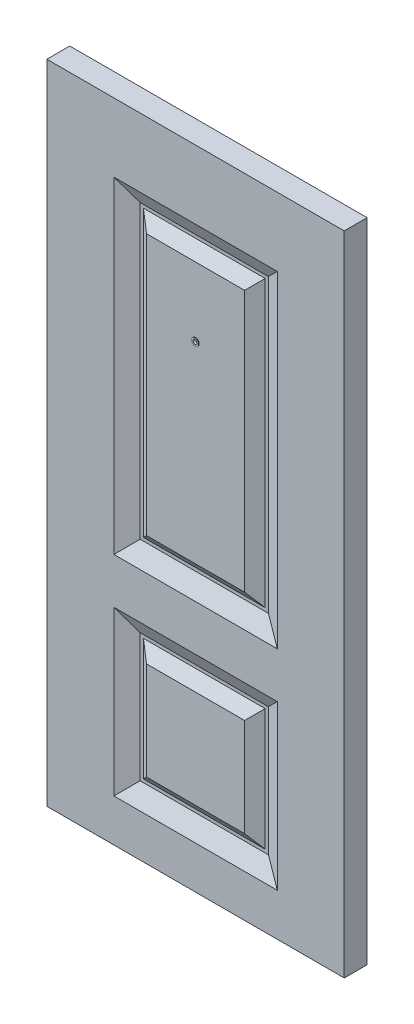
ISO-10303-21;
HEADER;
FILE_DESCRIPTION(('STEP AP214'),'2;1');
FILE_NAME('part.step','',(''),(''),'','','');
FILE_SCHEMA(('AUTOMOTIVE_DESIGN { 1 0 10303 214 1 1 1 1 }'));
ENDSEC;
DATA;
#1=APPLICATION_CONTEXT('core data for automotive mechanical design processes');
#2=APPLICATION_PROTOCOL_DEFINITION('international standard','automotive_design',2000,#1);
#3=PRODUCT_CONTEXT('',#1,'mechanical');
#4=PRODUCT('Part','Part','',(#3));
#5=PRODUCT_RELATED_PRODUCT_CATEGORY('part','',(#4));
#6=PRODUCT_DEFINITION_FORMATION('','',#4);
#7=PRODUCT_DEFINITION_CONTEXT('part definition',#1,'design');
#8=PRODUCT_DEFINITION('design','',#6,#7);
#9=PRODUCT_DEFINITION_SHAPE('','',#8);
#10=(LENGTH_UNIT() NAMED_UNIT(*) SI_UNIT(.MILLI.,.METRE.));
#11=(NAMED_UNIT(*) PLANE_ANGLE_UNIT() SI_UNIT($,.RADIAN.));
#12=(NAMED_UNIT(*) SI_UNIT($,.STERADIAN.) SOLID_ANGLE_UNIT());
#13=UNCERTAINTY_MEASURE_WITH_UNIT(LENGTH_MEASURE(1.E-05),#10,'distance_accuracy_value','');
#14=(GEOMETRIC_REPRESENTATION_CONTEXT(3) GLOBAL_UNCERTAINTY_ASSIGNED_CONTEXT((#13)) GLOBAL_UNIT_ASSIGNED_CONTEXT((#10,
#11,#12)) REPRESENTATION_CONTEXT('',''));
#15=CARTESIAN_POINT('',(0.,0.,0.));
#16=DIRECTION('',(0.,0.,1.));
#17=DIRECTION('',(1.,0.,0.));
#18=AXIS2_PLACEMENT_3D('',#15,#16,#17);
#19=CARTESIAN_POINT('',(0.,469.,37.));
#20=DIRECTION('',(0.,0.,1.));
#21=DIRECTION('',(1.,0.,0.));
#22=AXIS2_PLACEMENT_3D('',#19,#20,#21);
#23=PLANE('',#22);
#24=CARTESIAN_POINT('',(0.,469.,37.));
#25=DIRECTION('',(0.,0.,1.));
#26=DIRECTION('',(1.,0.,0.));
#27=AXIS2_PLACEMENT_3D('',#24,#25,#26);
#28=CIRCLE('',#27,11.);
#29=CARTESIAN_POINT('',(11.,469.,37.));
#30=VERTEX_POINT('',#29);
#31=EDGE_CURVE('E81',#30,#30,#28,.T.);
#32=ORIENTED_EDGE('',*,*,#31,.T.);
#33=EDGE_LOOP('',(#32));
#34=FACE_BOUND('',#33,.T.);
#35=CARTESIAN_POINT('',(0.,469.,37.));
#36=DIRECTION('',(0.,0.,1.));
#37=DIRECTION('',(1.,0.,0.));
#38=AXIS2_PLACEMENT_3D('',#35,#36,#37);
#39=CIRCLE('',#38,6.);
#40=CARTESIAN_POINT('',(6.,469.,37.));
#41=VERTEX_POINT('',#40);
#42=EDGE_CURVE('E198',#41,#41,#39,.T.);
#43=ORIENTED_EDGE('',*,*,#42,.F.);
#44=EDGE_LOOP('',(#43));
#45=FACE_BOUND('',#44,.T.);
#46=ADVANCED_FACE('F77',(#34,#45),#23,.T.);
#47=CARTESIAN_POINT('',(0.,469.,-35.));
#48=DIRECTION('',(0.,0.,1.));
#49=DIRECTION('',(1.,0.,0.));
#50=AXIS2_PLACEMENT_3D('',#47,#48,#49);
#51=CYLINDRICAL_SURFACE('',#50,6.);
#52=ORIENTED_EDGE('',*,*,#42,.T.);
#53=EDGE_LOOP('',(#52));
#54=FACE_BOUND('',#53,.T.);
#55=CARTESIAN_POINT('',(0.,469.,-35.));
#56=DIRECTION('',(0.,0.,1.));
#57=DIRECTION('',(1.,0.,0.));
#58=AXIS2_PLACEMENT_3D('',#55,#56,#57);
#59=CIRCLE('',#58,6.);
#60=CARTESIAN_POINT('',(6.,469.,-35.));
#61=VERTEX_POINT('',#60);
#62=EDGE_CURVE('E195',#61,#61,#59,.T.);
#63=ORIENTED_EDGE('',*,*,#62,.F.);
#64=EDGE_LOOP('',(#63));
#65=FACE_BOUND('',#64,.T.);
#66=ADVANCED_FACE('F213',(#54,#65),#51,.F.);
#67=CARTESIAN_POINT('',(0.,469.,-35.));
#68=DIRECTION('',(0.,0.,1.));
#69=DIRECTION('',(1.,0.,0.));
#70=AXIS2_PLACEMENT_3D('',#67,#68,#69);
#71=CYLINDRICAL_SURFACE('',#70,11.);
#72=ORIENTED_EDGE('',*,*,#31,.F.);
#73=EDGE_LOOP('',(#72));
#74=FACE_BOUND('',#73,.T.);
#75=CARTESIAN_POINT('',(0.,469.,35.));
#76=DIRECTION('',(0.,0.,-1.));
#77=DIRECTION('',(-1.,0.,0.));
#78=AXIS2_PLACEMENT_3D('',#75,#76,#77);
#79=CIRCLE('',#78,11.);
#80=CARTESIAN_POINT('',(-11.,469.,35.));
#81=VERTEX_POINT('',#80);
#82=EDGE_CURVE('E11',#81,#81,#79,.T.);
#83=ORIENTED_EDGE('',*,*,#82,.F.);
#84=EDGE_LOOP('',(#83));
#85=FACE_BOUND('',#84,.T.);
#86=ADVANCED_FACE('F79',(#74,#85),#71,.T.);
#87=CARTESIAN_POINT('',(0.,0.,-35.));
#88=DIRECTION('',(0.,0.,-1.));
#89=DIRECTION('',(-1.,0.,0.));
#90=AXIS2_PLACEMENT_3D('',#87,#88,#89);
#91=PLANE('',#90);
#92=ORIENTED_EDGE('',*,*,#62,.T.);
#93=EDGE_LOOP('',(#92));
#94=FACE_BOUND('',#93,.T.);
#95=DIRECTION('',(0.,1.,0.));
#96=VECTOR('',#95,1.);
#97=CARTESIAN_POINT('',(455.,-990.,-35.));
#98=LINE('',#97,#96);
#99=CARTESIAN_POINT('',(455.,-990.,-35.));
#100=VERTEX_POINT('',#99);
#101=CARTESIAN_POINT('',(455.,990.,-35.));
#102=VERTEX_POINT('',#101);
#103=EDGE_CURVE('E311',#100,#102,#98,.T.);
#104=ORIENTED_EDGE('',*,*,#103,.F.);
#105=DIRECTION('',(1.,0.,0.));
#106=VECTOR('',#105,1.);
#107=CARTESIAN_POINT('',(-455.,-990.,-35.));
#108=LINE('',#107,#106);
#109=CARTESIAN_POINT('',(-455.,-990.,-35.));
#110=VERTEX_POINT('',#109);
#111=EDGE_CURVE('E374',#110,#100,#108,.T.);
#112=ORIENTED_EDGE('',*,*,#111,.F.);
#113=DIRECTION('',(0.,-1.,0.));
#114=VECTOR('',#113,1.);
#115=CARTESIAN_POINT('',(-455.,-990.,-35.));
#116=LINE('',#115,#114);
#117=CARTESIAN_POINT('',(-455.,990.,-35.));
#118=VERTEX_POINT('',#117);
#119=EDGE_CURVE('E395',#118,#110,#116,.T.);
#120=ORIENTED_EDGE('',*,*,#119,.F.);
#121=DIRECTION('',(-1.,0.,0.));
#122=VECTOR('',#121,1.);
#123=CARTESIAN_POINT('',(-455.,990.,-35.));
#124=LINE('',#123,#122);
#125=EDGE_CURVE('E391',#102,#118,#124,.T.);
#126=ORIENTED_EDGE('',*,*,#125,.F.);
#127=EDGE_LOOP('',(#104,#112,#120,#126));
#128=FACE_BOUND('',#127,.T.);
#129=ADVANCED_FACE('F212',(#94,#128),#91,.T.);
#130=CARTESIAN_POINT('',(0.,0.,35.));
#131=DIRECTION('',(0.,0.,-1.));
#132=DIRECTION('',(-1.,0.,0.));
#133=AXIS2_PLACEMENT_3D('',#130,#131,#132);
#134=PLANE('',#133);
#135=DIRECTION('',(0.,-1.,0.));
#136=VECTOR('',#135,1.);
#137=CARTESIAN_POINT('',(150.,-360.,35.));
#138=LINE('',#137,#136);
#139=CARTESIAN_POINT('',(150.,-460.,35.));
#140=VERTEX_POINT('',#139);
#141=CARTESIAN_POINT('',(150.,-760.,35.));
#142=VERTEX_POINT('',#141);
#143=EDGE_CURVE('E342',#140,#142,#138,.T.);
#144=ORIENTED_EDGE('',*,*,#143,.F.);
#145=DIRECTION('',(1.,0.,0.));
#146=VECTOR('',#145,1.);
#147=CARTESIAN_POINT('',(-250.,-460.,35.));
#148=LINE('',#147,#146);
#149=CARTESIAN_POINT('',(-150.,-460.,35.));
#150=VERTEX_POINT('',#149);
#151=EDGE_CURVE('E175',#150,#140,#148,.T.);
#152=ORIENTED_EDGE('',*,*,#151,.F.);
#153=DIRECTION('',(0.,1.,0.));
#154=VECTOR('',#153,1.);
#155=CARTESIAN_POINT('',(-150.,-860.,35.));
#156=LINE('',#155,#154);
#157=CARTESIAN_POINT('',(-150.,-760.,35.));
#158=VERTEX_POINT('',#157);
#159=EDGE_CURVE('E320',#158,#150,#156,.T.);
#160=ORIENTED_EDGE('',*,*,#159,.F.);
#161=DIRECTION('',(-1.,0.,0.));
#162=VECTOR('',#161,1.);
#163=CARTESIAN_POINT('',(250.,-760.,35.));
#164=LINE('',#163,#162);
#165=EDGE_CURVE('E288',#142,#158,#164,.T.);
#166=ORIENTED_EDGE('',*,*,#165,.F.);
#167=EDGE_LOOP('',(#144,#152,#160,#166));
#168=FACE_BOUND('',#167,.T.);
#169=ADVANCED_FACE('F223',(#168),#134,.F.);
#170=CARTESIAN_POINT('',(150.,-760.,35.));
#171=DIRECTION('',(-0.592520250213931,0.,-0.805555555555556));
#172=DIRECTION('',(-0.805555555555556,0.,0.592520250213931));
#173=AXIS2_PLACEMENT_3D('',#170,#171,#172);
#174=PLANE('',#173);
#175=DIRECTION('',(-0.627329537872645,0.627329537872645,0.461427461065104));
#176=VECTOR('',#175,1.);
#177=CARTESIAN_POINT('',(189.354234908751,-799.35423490875,6.05329240882797));
#178=LINE('',#177,#176);
#179=CARTESIAN_POINT('',(186.25,-796.25,8.33658874037308));
#180=VERTEX_POINT('',#179);
#181=EDGE_CURVE('E293',#180,#142,#178,.T.);
#182=ORIENTED_EDGE('',*,*,#181,.F.);
#183=DIRECTION('',(0.,-1.,0.));
#184=VECTOR('',#183,1.);
#185=CARTESIAN_POINT('',(186.25,-360.,8.33658874037308));
#186=LINE('',#185,#184);
#187=CARTESIAN_POINT('',(186.25,-423.75,8.33658874037306));
#188=VERTEX_POINT('',#187);
#189=EDGE_CURVE('E346',#188,#180,#186,.T.);
#190=ORIENTED_EDGE('',*,*,#189,.F.);
#191=DIRECTION('',(-0.627329537872645,-0.627329537872645,0.461427461065104));
#192=VECTOR('',#191,1.);
#193=CARTESIAN_POINT('',(189.354234908751,-420.645765091249,6.053292408828));
#194=LINE('',#193,#192);
#195=EDGE_CURVE('E326',#188,#140,#194,.T.);
#196=ORIENTED_EDGE('',*,*,#195,.T.);
#197=ORIENTED_EDGE('',*,*,#143,.T.);
#198=EDGE_LOOP('',(#182,#190,#196,#197));
#199=FACE_BOUND('',#198,.T.);
#200=ADVANCED_FACE('F516',(#199),#174,.F.);
#201=CARTESIAN_POINT('',(-250.,-460.,35.));
#202=DIRECTION('',(0.,-0.592520250213931,-0.805555555555556));
#203=DIRECTION('',(0.,0.805555555555556,-0.592520250213931));
#204=AXIS2_PLACEMENT_3D('',#201,#202,#203);
#205=PLANE('',#204);
#206=DIRECTION('',(1.,0.,0.));
#207=VECTOR('',#206,1.);
#208=CARTESIAN_POINT('',(-250.,-423.75,8.33658874037308));
#209=LINE('',#208,#207);
#210=CARTESIAN_POINT('',(-186.25,-423.75,8.33658874037307));
#211=VERTEX_POINT('',#210);
#212=EDGE_CURVE('E168',#211,#188,#209,.T.);
#213=ORIENTED_EDGE('',*,*,#212,.F.);
#214=DIRECTION('',(0.627329537872645,-0.627329537872645,0.461427461065104));
#215=VECTOR('',#214,1.);
#216=CARTESIAN_POINT('',(7.4169396350027,-617.416939635002,150.786830364688));
#217=LINE('',#216,#215);
#218=EDGE_CURVE('E301',#211,#150,#217,.T.);
#219=ORIENTED_EDGE('',*,*,#218,.T.);
#220=ORIENTED_EDGE('',*,*,#151,.T.);
#221=ORIENTED_EDGE('',*,*,#195,.F.);
#222=EDGE_LOOP('',(#213,#219,#220,#221));
#223=FACE_BOUND('',#222,.T.);
#224=ADVANCED_FACE('F551',(#223),#205,.F.);
#225=CARTESIAN_POINT('',(-150.,-860.,35.));
#226=DIRECTION('',(0.592520250213931,0.,-0.805555555555556));
#227=DIRECTION('',(-0.805555555555556,0.,-0.592520250213931));
#228=AXIS2_PLACEMENT_3D('',#225,#226,#227);
#229=PLANE('',#228);
#230=DIRECTION('',(0.,1.,0.));
#231=VECTOR('',#230,1.);
#232=CARTESIAN_POINT('',(-186.25,-860.,8.33658874037308));
#233=LINE('',#232,#231);
#234=CARTESIAN_POINT('',(-186.25,-796.25,8.33658874037307));
#235=VERTEX_POINT('',#234);
#236=EDGE_CURVE('E322',#235,#211,#233,.T.);
#237=ORIENTED_EDGE('',*,*,#236,.F.);
#238=DIRECTION('',(0.627329537872645,0.627329537872645,0.461427461065104));
#239=VECTOR('',#238,1.);
#240=CARTESIAN_POINT('',(7.41693963500281,-602.583060364997,150.786830364688));
#241=LINE('',#240,#239);
#242=EDGE_CURVE('E282',#235,#158,#241,.T.);
#243=ORIENTED_EDGE('',*,*,#242,.T.);
#244=ORIENTED_EDGE('',*,*,#159,.T.);
#245=ORIENTED_EDGE('',*,*,#218,.F.);
#246=EDGE_LOOP('',(#237,#243,#244,#245));
#247=FACE_BOUND('',#246,.T.);
#248=ADVANCED_FACE('F560',(#247),#229,.F.);
#249=CARTESIAN_POINT('',(250.,-760.,35.));
#250=DIRECTION('',(0.,0.592520250213931,-0.805555555555556));
#251=DIRECTION('',(0.,0.805555555555556,0.592520250213931));
#252=AXIS2_PLACEMENT_3D('',#249,#250,#251);
#253=PLANE('',#252);
#254=ORIENTED_EDGE('',*,*,#181,.T.);
#255=ORIENTED_EDGE('',*,*,#165,.T.);
#256=ORIENTED_EDGE('',*,*,#242,.F.);
#257=DIRECTION('',(-1.,0.,0.));
#258=VECTOR('',#257,1.);
#259=CARTESIAN_POINT('',(250.,-796.25,8.33658874037308));
#260=LINE('',#259,#258);
#261=EDGE_CURVE('E283',#180,#235,#260,.T.);
#262=ORIENTED_EDGE('',*,*,#261,.F.);
#263=EDGE_LOOP('',(#254,#255,#256,#262));
#264=FACE_BOUND('',#263,.T.);
#265=ADVANCED_FACE('F569',(#264),#253,.F.);
#266=CARTESIAN_POINT('',(186.25,-760.,8.33658874037308));
#267=DIRECTION('',(0.,0.,-1.));
#268=DIRECTION('',(-1.,0.,0.));
#269=AXIS2_PLACEMENT_3D('',#266,#267,#268);
#270=PLANE('',#269);
#271=ORIENTED_EDGE('',*,*,#261,.T.);
#272=ORIENTED_EDGE('',*,*,#236,.T.);
#273=ORIENTED_EDGE('',*,*,#212,.T.);
#274=ORIENTED_EDGE('',*,*,#189,.T.);
#275=EDGE_LOOP('',(#271,#272,#273,#274));
#276=FACE_BOUND('',#275,.T.);
#277=DIRECTION('',(-1.,0.,0.));
#278=VECTOR('',#277,1.);
#279=CARTESIAN_POINT('',(250.,-806.25,8.33658874037308));
#280=LINE('',#279,#278);
#281=CARTESIAN_POINT('',(196.25,-806.25,8.33658874037308));
#282=VERTEX_POINT('',#281);
#283=CARTESIAN_POINT('',(-196.25,-806.25,8.33658874037308));
#284=VERTEX_POINT('',#283);
#285=EDGE_CURVE('E289',#282,#284,#280,.T.);
#286=ORIENTED_EDGE('',*,*,#285,.F.);
#287=DIRECTION('',(0.,-1.,0.));
#288=VECTOR('',#287,1.);
#289=CARTESIAN_POINT('',(196.25,-360.,8.33658874037308));
#290=LINE('',#289,#288);
#291=CARTESIAN_POINT('',(196.25,-413.75,8.33658874037308));
#292=VERTEX_POINT('',#291);
#293=EDGE_CURVE('E336',#292,#282,#290,.T.);
#294=ORIENTED_EDGE('',*,*,#293,.F.);
#295=DIRECTION('',(1.,0.,0.));
#296=VECTOR('',#295,1.);
#297=CARTESIAN_POINT('',(-250.,-413.75,8.33658874037308));
#298=LINE('',#297,#296);
#299=CARTESIAN_POINT('',(-196.25,-413.75,8.33658874037308));
#300=VERTEX_POINT('',#299);
#301=EDGE_CURVE('E340',#300,#292,#298,.T.);
#302=ORIENTED_EDGE('',*,*,#301,.F.);
#303=DIRECTION('',(0.,1.,0.));
#304=VECTOR('',#303,1.);
#305=CARTESIAN_POINT('',(-196.25,-860.,8.33658874037308));
#306=LINE('',#305,#304);
#307=EDGE_CURVE('E321',#284,#300,#306,.T.);
#308=ORIENTED_EDGE('',*,*,#307,.F.);
#309=EDGE_LOOP('',(#286,#294,#302,#308));
#310=FACE_BOUND('',#309,.T.);
#311=ADVANCED_FACE('F504',(#276,#310),#270,.F.);
#312=CARTESIAN_POINT('',(-260.1,-166.25,8.33658874037308));
#313=DIRECTION('',(0.,0.444390187660449,0.895833333333333));
#314=DIRECTION('',(0.,-0.895833333333333,0.444390187660449));
#315=AXIS2_PLACEMENT_3D('',#312,#313,#314);
#316=PLANE('',#315);
#317=DIRECTION('',(1.,0.,0.));
#318=VECTOR('',#317,1.);
#319=CARTESIAN_POINT('',(-260.1,-220.,35.));
#320=LINE('',#319,#318);
#321=CARTESIAN_POINT('',(-250.,-220.,35.));
#322=VERTEX_POINT('',#321);
#323=CARTESIAN_POINT('',(250.,-220.,35.));
#324=VERTEX_POINT('',#323);
#325=EDGE_CURVE('E145',#322,#324,#320,.T.);
#326=ORIENTED_EDGE('',*,*,#325,.T.);
#327=DIRECTION('',(-0.66724832158524,0.667248321585239,-0.330997514618103));
#328=VECTOR('',#327,1.);
#329=CARTESIAN_POINT('',(224.677317601734,-194.677317601733,22.4383424189416));
#330=LINE('',#329,#328);
#331=CARTESIAN_POINT('',(196.25,-166.25,8.33658874037308));
#332=VERTEX_POINT('',#331);
#333=EDGE_CURVE('E139',#324,#332,#330,.T.);
#334=ORIENTED_EDGE('',*,*,#333,.T.);
#335=DIRECTION('',(1.,0.,0.));
#336=VECTOR('',#335,1.);
#337=CARTESIAN_POINT('',(-260.1,-166.25,8.33658874037308));
#338=LINE('',#337,#336);
#339=CARTESIAN_POINT('',(-196.25,-166.25,8.33658874037311));
#340=VERTEX_POINT('',#339);
#341=EDGE_CURVE('E142',#340,#332,#338,.T.);
#342=ORIENTED_EDGE('',*,*,#341,.F.);
#343=DIRECTION('',(0.667248321585239,0.66724832158524,-0.330997514618103));
#344=VECTOR('',#343,1.);
#345=CARTESIAN_POINT('',(-224.677317601733,-194.677317601733,22.4383424189416));
#346=LINE('',#345,#344);
#347=EDGE_CURVE('E259',#322,#340,#346,.T.);
#348=ORIENTED_EDGE('',*,*,#347,.F.);
#349=EDGE_LOOP('',(#326,#334,#342,#348));
#350=FACE_BOUND('',#349,.T.);
#351=ADVANCED_FACE('F141',(#350),#316,.T.);
#352=CARTESIAN_POINT('',(-196.25,790.1,8.33658874037308));
#353=DIRECTION('',(0.444390187660449,0.,0.895833333333333));
#354=DIRECTION('',(0.895833333333333,0.,-0.444390187660449));
#355=AXIS2_PLACEMENT_3D('',#352,#353,#354);
#356=PLANE('',#355);
#357=DIRECTION('',(0.,-1.,0.));
#358=VECTOR('',#357,1.);
#359=CARTESIAN_POINT('',(-250.,790.1,35.));
#360=LINE('',#359,#358);
#361=CARTESIAN_POINT('',(-250.,780.,35.));
#362=VERTEX_POINT('',#361);
#363=EDGE_CURVE('E96',#362,#322,#360,.T.);
#364=ORIENTED_EDGE('',*,*,#363,.T.);
#365=ORIENTED_EDGE('',*,*,#347,.T.);
#366=DIRECTION('',(0.,-1.,0.));
#367=VECTOR('',#366,1.);
#368=CARTESIAN_POINT('',(-196.25,790.1,8.33658874037308));
#369=LINE('',#368,#367);
#370=CARTESIAN_POINT('',(-196.25,726.25,8.3365887403731));
#371=VERTEX_POINT('',#370);
#372=EDGE_CURVE('E159',#371,#340,#369,.T.);
#373=ORIENTED_EDGE('',*,*,#372,.F.);
#374=DIRECTION('',(0.66724832158524,-0.667248321585239,-0.330997514618103));
#375=VECTOR('',#374,1.);
#376=CARTESIAN_POINT('',(6.92629424512409,523.073705754876,-92.4517478487378));
#377=LINE('',#376,#375);
#378=EDGE_CURVE('E251',#362,#371,#377,.T.);
#379=ORIENTED_EDGE('',*,*,#378,.F.);
#380=EDGE_LOOP('',(#364,#365,#373,#379));
#381=FACE_BOUND('',#380,.T.);
#382=ADVANCED_FACE('F503',(#381),#356,.T.);
#383=CARTESIAN_POINT('',(260.1,726.25,8.33658874037308));
#384=DIRECTION('',(0.,-0.444390187660449,0.895833333333333));
#385=DIRECTION('',(0.,-0.895833333333333,-0.444390187660449));
#386=AXIS2_PLACEMENT_3D('',#383,#384,#385);
#387=PLANE('',#386);
#388=DIRECTION('',(-1.,0.,0.));
#389=VECTOR('',#388,1.);
#390=CARTESIAN_POINT('',(260.1,780.,35.));
#391=LINE('',#390,#389);
#392=CARTESIAN_POINT('',(250.,780.,35.));
#393=VERTEX_POINT('',#392);
#394=EDGE_CURVE('E241',#393,#362,#391,.T.);
#395=ORIENTED_EDGE('',*,*,#394,.T.);
#396=ORIENTED_EDGE('',*,*,#378,.T.);
#397=DIRECTION('',(-1.,0.,0.));
#398=VECTOR('',#397,1.);
#399=CARTESIAN_POINT('',(260.1,726.25,8.33658874037308));
#400=LINE('',#399,#398);
#401=CARTESIAN_POINT('',(196.25,726.25,8.3365887403731));
#402=VERTEX_POINT('',#401);
#403=EDGE_CURVE('E246',#402,#371,#400,.T.);
#404=ORIENTED_EDGE('',*,*,#403,.F.);
#405=DIRECTION('',(-0.66724832158524,-0.66724832158524,-0.330997514618103));
#406=VECTOR('',#405,1.);
#407=CARTESIAN_POINT('',(-229.536455574283,300.463544425717,-202.880515887645));
#408=LINE('',#407,#406);
#409=EDGE_CURVE('E165',#393,#402,#408,.T.);
#410=ORIENTED_EDGE('',*,*,#409,.F.);
#411=EDGE_LOOP('',(#395,#396,#404,#410));
#412=FACE_BOUND('',#411,.T.);
#413=ADVANCED_FACE('F507',(#412),#387,.T.);
#414=CARTESIAN_POINT('',(196.25,-230.1,8.33658874037308));
#415=DIRECTION('',(-0.444390187660449,0.,0.895833333333333));
#416=DIRECTION('',(0.895833333333333,0.,0.444390187660449));
#417=AXIS2_PLACEMENT_3D('',#414,#415,#416);
#418=PLANE('',#417);
#419=ORIENTED_EDGE('',*,*,#333,.F.);
#420=DIRECTION('',(0.,1.,0.));
#421=VECTOR('',#420,1.);
#422=CARTESIAN_POINT('',(250.,-230.1,35.));
#423=LINE('',#422,#421);
#424=EDGE_CURVE('E167',#324,#393,#423,.T.);
#425=ORIENTED_EDGE('',*,*,#424,.T.);
#426=ORIENTED_EDGE('',*,*,#409,.T.);
#427=DIRECTION('',(0.,1.,0.));
#428=VECTOR('',#427,1.);
#429=CARTESIAN_POINT('',(196.25,-230.1,8.33658874037308));
#430=LINE('',#429,#428);
#431=EDGE_CURVE('E158',#332,#402,#430,.T.);
#432=ORIENTED_EDGE('',*,*,#431,.F.);
#433=EDGE_LOOP('',(#419,#425,#426,#432));
#434=FACE_BOUND('',#433,.T.);
#435=ADVANCED_FACE('F164',(#434),#418,.T.);
#436=CARTESIAN_POINT('',(-260.1,-156.25,8.33658874037308));
#437=DIRECTION('',(0.,0.,1.));
#438=DIRECTION('',(1.,0.,0.));
#439=AXIS2_PLACEMENT_3D('',#436,#437,#438);
#440=PLANE('',#439);
#441=DIRECTION('',(-1.,0.,0.));
#442=VECTOR('',#441,1.);
#443=CARTESIAN_POINT('',(260.1,716.25,8.33658874037308));
#444=LINE('',#443,#442);
#445=CARTESIAN_POINT('',(186.25,716.25,8.33658874037311));
#446=VERTEX_POINT('',#445);
#447=CARTESIAN_POINT('',(-186.25,716.25,8.33658874037307));
#448=VERTEX_POINT('',#447);
#449=EDGE_CURVE('E161',#446,#448,#444,.T.);
#450=ORIENTED_EDGE('',*,*,#449,.F.);
#451=DIRECTION('',(0.,1.,0.));
#452=VECTOR('',#451,1.);
#453=CARTESIAN_POINT('',(186.25,-230.1,8.33658874037308));
#454=LINE('',#453,#452);
#455=CARTESIAN_POINT('',(186.25,-156.25,8.33658874037308));
#456=VERTEX_POINT('',#455);
#457=EDGE_CURVE('E183',#456,#446,#454,.T.);
#458=ORIENTED_EDGE('',*,*,#457,.F.);
#459=DIRECTION('',(1.,0.,0.));
#460=VECTOR('',#459,1.);
#461=CARTESIAN_POINT('',(-260.1,-156.25,8.33658874037308));
#462=LINE('',#461,#460);
#463=CARTESIAN_POINT('',(-186.25,-156.25,8.33658874037309));
#464=VERTEX_POINT('',#463);
#465=EDGE_CURVE('E260',#464,#456,#462,.T.);
#466=ORIENTED_EDGE('',*,*,#465,.F.);
#467=DIRECTION('',(0.,-1.,0.));
#468=VECTOR('',#467,1.);
#469=CARTESIAN_POINT('',(-186.25,790.1,8.33658874037308));
#470=LINE('',#469,#468);
#471=EDGE_CURVE('E199',#448,#464,#470,.T.);
#472=ORIENTED_EDGE('',*,*,#471,.F.);
#473=EDGE_LOOP('',(#450,#458,#466,#472));
#474=FACE_BOUND('',#473,.T.);
#475=ORIENTED_EDGE('',*,*,#341,.T.);
#476=ORIENTED_EDGE('',*,*,#431,.T.);
#477=ORIENTED_EDGE('',*,*,#403,.T.);
#478=ORIENTED_EDGE('',*,*,#372,.T.);
#479=EDGE_LOOP('',(#475,#476,#477,#478));
#480=FACE_BOUND('',#479,.T.);
#481=ADVANCED_FACE('F156',(#474,#480),#440,.T.);
#482=CARTESIAN_POINT('',(-260.1,-120.,35.));
#483=DIRECTION('',(0.,-0.592520250213932,0.805555555555556));
#484=DIRECTION('',(0.,-0.805555555555556,-0.592520250213932));
#485=AXIS2_PLACEMENT_3D('',#482,#483,#484);
#486=PLANE('',#485);
#487=ORIENTED_EDGE('',*,*,#465,.T.);
#488=DIRECTION('',(-0.627329537872645,0.627329537872645,0.461427461065104));
#489=VECTOR('',#488,1.);
#490=CARTESIAN_POINT('',(193.329012634535,-163.329012634534,3.12967494211969));
#491=LINE('',#490,#489);
#492=CARTESIAN_POINT('',(150.,-120.,35.));
#493=VERTEX_POINT('',#492);
#494=EDGE_CURVE('E132',#456,#493,#491,.T.);
#495=ORIENTED_EDGE('',*,*,#494,.T.);
#496=DIRECTION('',(1.,0.,0.));
#497=VECTOR('',#496,1.);
#498=CARTESIAN_POINT('',(-260.1,-120.,35.));
#499=LINE('',#498,#497);
#500=CARTESIAN_POINT('',(-150.,-120.,35.));
#501=VERTEX_POINT('',#500);
#502=EDGE_CURVE('E230',#501,#493,#499,.T.);
#503=ORIENTED_EDGE('',*,*,#502,.F.);
#504=DIRECTION('',(0.627329537872645,0.627329537872645,0.461427461065104));
#505=VECTOR('',#504,1.);
#506=CARTESIAN_POINT('',(-193.329012634534,-163.329012634534,3.12967494211971));
#507=LINE('',#506,#505);
#508=EDGE_CURVE('E255',#464,#501,#507,.T.);
#509=ORIENTED_EDGE('',*,*,#508,.F.);
#510=EDGE_LOOP('',(#487,#495,#503,#509));
#511=FACE_BOUND('',#510,.T.);
#512=ADVANCED_FACE('F489',(#511),#486,.T.);
#513=CARTESIAN_POINT('',(-150.,790.1,35.));
#514=DIRECTION('',(-0.592520250213932,0.,0.805555555555556));
#515=DIRECTION('',(0.805555555555556,0.,0.592520250213932));
#516=AXIS2_PLACEMENT_3D('',#513,#514,#515);
#517=PLANE('',#516);
#518=ORIENTED_EDGE('',*,*,#471,.T.);
#519=ORIENTED_EDGE('',*,*,#508,.T.);
#520=DIRECTION('',(0.,-1.,0.));
#521=VECTOR('',#520,1.);
#522=CARTESIAN_POINT('',(-150.,790.1,35.));
#523=LINE('',#522,#521);
#524=CARTESIAN_POINT('',(-150.,680.,35.));
#525=VERTEX_POINT('',#524);
#526=EDGE_CURVE('E271',#525,#501,#523,.T.);
#527=ORIENTED_EDGE('',*,*,#526,.F.);
#528=DIRECTION('',(0.627329537872645,-0.627329537872645,0.461427461065104));
#529=VECTOR('',#528,1.);
#530=CARTESIAN_POINT('',(11.3917173607863,518.608282639214,153.710447831396));
#531=LINE('',#530,#529);
#532=EDGE_CURVE('E151',#448,#525,#531,.T.);
#533=ORIENTED_EDGE('',*,*,#532,.F.);
#534=EDGE_LOOP('',(#518,#519,#527,#533));
#535=FACE_BOUND('',#534,.T.);
#536=ADVANCED_FACE('F486',(#535),#517,.T.);
#537=CARTESIAN_POINT('',(260.1,680.,35.));
#538=DIRECTION('',(0.,0.592520250213932,0.805555555555556));
#539=DIRECTION('',(0.,-0.805555555555556,0.592520250213932));
#540=AXIS2_PLACEMENT_3D('',#537,#538,#539);
#541=PLANE('',#540);
#542=ORIENTED_EDGE('',*,*,#449,.T.);
#543=ORIENTED_EDGE('',*,*,#532,.T.);
#544=DIRECTION('',(-1.,0.,0.));
#545=VECTOR('',#544,1.);
#546=CARTESIAN_POINT('',(260.1,680.,35.));
#547=LINE('',#546,#545);
#548=CARTESIAN_POINT('',(150.,680.,35.));
#549=VERTEX_POINT('',#548);
#550=EDGE_CURVE('E229',#549,#525,#547,.T.);
#551=ORIENTED_EDGE('',*,*,#550,.F.);
#552=DIRECTION('',(-0.627329537872645,-0.627329537872645,0.461427461065104));
#553=VECTOR('',#552,1.);
#554=CARTESIAN_POINT('',(-208.162891904539,321.837108095461,298.443985787256));
#555=LINE('',#554,#553);
#556=EDGE_CURVE('E188',#446,#549,#555,.T.);
#557=ORIENTED_EDGE('',*,*,#556,.F.);
#558=EDGE_LOOP('',(#542,#543,#551,#557));
#559=FACE_BOUND('',#558,.T.);
#560=ADVANCED_FACE('F239',(#559),#541,.T.);
#561=CARTESIAN_POINT('',(150.,-230.1,35.));
#562=DIRECTION('',(0.592520250213932,0.,0.805555555555556));
#563=DIRECTION('',(0.805555555555556,0.,-0.592520250213932));
#564=AXIS2_PLACEMENT_3D('',#561,#562,#563);
#565=PLANE('',#564);
#566=ORIENTED_EDGE('',*,*,#494,.F.);
#567=ORIENTED_EDGE('',*,*,#457,.T.);
#568=ORIENTED_EDGE('',*,*,#556,.T.);
#569=DIRECTION('',(0.,1.,0.));
#570=VECTOR('',#569,1.);
#571=CARTESIAN_POINT('',(150.,-230.1,35.));
#572=LINE('',#571,#570);
#573=EDGE_CURVE('E172',#493,#549,#572,.T.);
#574=ORIENTED_EDGE('',*,*,#573,.F.);
#575=EDGE_LOOP('',(#566,#567,#568,#574));
#576=FACE_BOUND('',#575,.T.);
#577=ADVANCED_FACE('F220',(#576),#565,.T.);
#578=ORIENTED_EDGE('',*,*,#82,.T.);
#579=EDGE_LOOP('',(#578));
#580=FACE_BOUND('',#579,.T.);
#581=ORIENTED_EDGE('',*,*,#573,.T.);
#582=ORIENTED_EDGE('',*,*,#550,.T.);
#583=ORIENTED_EDGE('',*,*,#526,.T.);
#584=ORIENTED_EDGE('',*,*,#502,.T.);
#585=EDGE_LOOP('',(#581,#582,#583,#584));
#586=FACE_BOUND('',#585,.T.);
#587=ADVANCED_FACE('F216',(#580,#586),#134,.F.);
#588=CARTESIAN_POINT('',(196.25,-760.,8.33658874037308));
#589=DIRECTION('',(0.444390187660449,0.,-0.895833333333333));
#590=DIRECTION('',(-0.895833333333333,0.,-0.444390187660449));
#591=AXIS2_PLACEMENT_3D('',#588,#589,#590);
#592=PLANE('',#591);
#593=DIRECTION('',(-0.66724832158524,0.667248321585239,-0.330997514618103));
#594=VECTOR('',#593,1.);
#595=CARTESIAN_POINT('',(220.180592342885,-830.180592342884,20.2076813045557));
#596=LINE('',#595,#594);
#597=CARTESIAN_POINT('',(250.,-860.,35.));
#598=VERTEX_POINT('',#597);
#599=EDGE_CURVE('E297',#598,#282,#596,.T.);
#600=ORIENTED_EDGE('',*,*,#599,.F.);
#601=DIRECTION('',(0.,-1.,0.));
#602=VECTOR('',#601,1.);
#603=CARTESIAN_POINT('',(250.,-360.,35.));
#604=LINE('',#603,#602);
#605=CARTESIAN_POINT('',(250.,-360.,35.));
#606=VERTEX_POINT('',#605);
#607=EDGE_CURVE('E341',#606,#598,#604,.T.);
#608=ORIENTED_EDGE('',*,*,#607,.F.);
#609=DIRECTION('',(-0.667248321585239,-0.66724832158524,-0.330997514618103));
#610=VECTOR('',#609,1.);
#611=CARTESIAN_POINT('',(220.180592342885,-389.819407657115,20.2076813045557));
#612=LINE('',#611,#610);
#613=EDGE_CURVE('E350',#606,#292,#612,.T.);
#614=ORIENTED_EDGE('',*,*,#613,.T.);
#615=ORIENTED_EDGE('',*,*,#293,.T.);
#616=EDGE_LOOP('',(#600,#608,#614,#615));
#617=FACE_BOUND('',#616,.T.);
#618=ADVANCED_FACE('F219',(#617),#592,.F.);
#619=CARTESIAN_POINT('',(-250.,-413.75,8.33658874037308));
#620=DIRECTION('',(0.,0.444390187660449,-0.895833333333333));
#621=DIRECTION('',(0.,0.895833333333333,0.444390187660449));
#622=AXIS2_PLACEMENT_3D('',#619,#620,#621);
#623=PLANE('',#622);
#624=DIRECTION('',(1.,0.,0.));
#625=VECTOR('',#624,1.);
#626=CARTESIAN_POINT('',(-250.,-360.,35.));
#627=LINE('',#626,#625);
#628=CARTESIAN_POINT('',(-250.,-360.,35.));
#629=VERTEX_POINT('',#628);
#630=EDGE_CURVE('E360',#629,#606,#627,.T.);
#631=ORIENTED_EDGE('',*,*,#630,.F.);
#632=DIRECTION('',(0.66724832158524,-0.66724832158524,-0.330997514618103));
#633=VECTOR('',#632,1.);
#634=CARTESIAN_POINT('',(2.42956898627522,-612.429568986275,-90.221086734352));
#635=LINE('',#634,#633);
#636=EDGE_CURVE('E315',#629,#300,#635,.T.);
#637=ORIENTED_EDGE('',*,*,#636,.T.);
#638=ORIENTED_EDGE('',*,*,#301,.T.);
#639=ORIENTED_EDGE('',*,*,#613,.F.);
#640=EDGE_LOOP('',(#631,#637,#638,#639));
#641=FACE_BOUND('',#640,.T.);
#642=ADVANCED_FACE('F712',(#641),#623,.F.);
#643=CARTESIAN_POINT('',(-196.25,-860.,8.33658874037308));
#644=DIRECTION('',(-0.444390187660449,0.,-0.895833333333333));
#645=DIRECTION('',(-0.895833333333333,0.,0.444390187660449));
#646=AXIS2_PLACEMENT_3D('',#643,#644,#645);
#647=PLANE('',#646);
#648=DIRECTION('',(0.,1.,0.));
#649=VECTOR('',#648,1.);
#650=CARTESIAN_POINT('',(-250.,-860.,35.));
#651=LINE('',#650,#649);
#652=CARTESIAN_POINT('',(-250.,-860.,35.));
#653=VERTEX_POINT('',#652);
#654=EDGE_CURVE('E316',#653,#629,#651,.T.);
#655=ORIENTED_EDGE('',*,*,#654,.F.);
#656=DIRECTION('',(0.66724832158524,0.66724832158524,-0.330997514618103));
#657=VECTOR('',#656,1.);
#658=CARTESIAN_POINT('',(2.42956898627536,-607.570431013725,-90.221086734352));
#659=LINE('',#658,#657);
#660=EDGE_CURVE('E278',#653,#284,#659,.T.);
#661=ORIENTED_EDGE('',*,*,#660,.T.);
#662=ORIENTED_EDGE('',*,*,#307,.T.);
#663=ORIENTED_EDGE('',*,*,#636,.F.);
#664=EDGE_LOOP('',(#655,#661,#662,#663));
#665=FACE_BOUND('',#664,.T.);
#666=ADVANCED_FACE('F702',(#665),#647,.F.);
#667=CARTESIAN_POINT('',(250.,-806.25,8.33658874037308));
#668=DIRECTION('',(0.,-0.444390187660449,-0.895833333333333));
#669=DIRECTION('',(0.,0.895833333333333,-0.444390187660449));
#670=AXIS2_PLACEMENT_3D('',#667,#668,#669);
#671=PLANE('',#670);
#672=ORIENTED_EDGE('',*,*,#599,.T.);
#673=ORIENTED_EDGE('',*,*,#285,.T.);
#674=ORIENTED_EDGE('',*,*,#660,.F.);
#675=DIRECTION('',(-1.,0.,0.));
#676=VECTOR('',#675,1.);
#677=CARTESIAN_POINT('',(250.,-860.,35.));
#678=LINE('',#677,#676);
#679=EDGE_CURVE('E284',#598,#653,#678,.T.);
#680=ORIENTED_EDGE('',*,*,#679,.F.);
#681=EDGE_LOOP('',(#672,#673,#674,#680));
#682=FACE_BOUND('',#681,.T.);
#683=ADVANCED_FACE('F694',(#682),#671,.F.);
#684=DIRECTION('',(0.,1.,0.));
#685=VECTOR('',#684,1.);
#686=CARTESIAN_POINT('',(455.,-990.,35.));
#687=LINE('',#686,#685);
#688=CARTESIAN_POINT('',(455.,-990.,35.));
#689=VERTEX_POINT('',#688);
#690=CARTESIAN_POINT('',(455.,990.,35.));
#691=VERTEX_POINT('',#690);
#692=EDGE_CURVE('E370',#689,#691,#687,.T.);
#693=ORIENTED_EDGE('',*,*,#692,.T.);
#694=DIRECTION('',(-1.,0.,0.));
#695=VECTOR('',#694,1.);
#696=CARTESIAN_POINT('',(-455.,990.,35.));
#697=LINE('',#696,#695);
#698=CARTESIAN_POINT('',(-455.,990.,35.));
#699=VERTEX_POINT('',#698);
#700=EDGE_CURVE('E375',#691,#699,#697,.T.);
#701=ORIENTED_EDGE('',*,*,#700,.T.);
#702=DIRECTION('',(0.,-1.,0.));
#703=VECTOR('',#702,1.);
#704=CARTESIAN_POINT('',(-455.,-990.,35.));
#705=LINE('',#704,#703);
#706=CARTESIAN_POINT('',(-455.,-990.,35.));
#707=VERTEX_POINT('',#706);
#708=EDGE_CURVE('E379',#699,#707,#705,.T.);
#709=ORIENTED_EDGE('',*,*,#708,.T.);
#710=DIRECTION('',(1.,0.,0.));
#711=VECTOR('',#710,1.);
#712=CARTESIAN_POINT('',(-455.,-990.,35.));
#713=LINE('',#712,#711);
#714=EDGE_CURVE('E383',#707,#689,#713,.T.);
#715=ORIENTED_EDGE('',*,*,#714,.T.);
#716=EDGE_LOOP('',(#693,#701,#709,#715));
#717=FACE_BOUND('',#716,.T.);
#718=ORIENTED_EDGE('',*,*,#679,.T.);
#719=ORIENTED_EDGE('',*,*,#654,.T.);
#720=ORIENTED_EDGE('',*,*,#630,.T.);
#721=ORIENTED_EDGE('',*,*,#607,.T.);
#722=EDGE_LOOP('',(#718,#719,#720,#721));
#723=FACE_BOUND('',#722,.T.);
#724=ORIENTED_EDGE('',*,*,#394,.F.);
#725=ORIENTED_EDGE('',*,*,#424,.F.);
#726=ORIENTED_EDGE('',*,*,#325,.F.);
#727=ORIENTED_EDGE('',*,*,#363,.F.);
#728=EDGE_LOOP('',(#724,#725,#726,#727));
#729=FACE_BOUND('',#728,.T.);
#730=ADVANCED_FACE('F222',(#717,#723,#729),#134,.F.);
#731=CARTESIAN_POINT('',(-455.,990.,35.));
#732=DIRECTION('',(0.,-1.,0.));
#733=DIRECTION('',(0.,0.,-1.));
#734=AXIS2_PLACEMENT_3D('',#731,#732,#733);
#735=PLANE('',#734);
#736=ORIENTED_EDGE('',*,*,#125,.T.);
#737=DIRECTION('',(0.,0.,-1.));
#738=VECTOR('',#737,1.);
#739=CARTESIAN_POINT('',(-455.,990.,35.));
#740=LINE('',#739,#738);
#741=EDGE_CURVE('E409',#699,#118,#740,.T.);
#742=ORIENTED_EDGE('',*,*,#741,.F.);
#743=ORIENTED_EDGE('',*,*,#700,.F.);
#744=DIRECTION('',(0.,0.,-1.));
#745=VECTOR('',#744,1.);
#746=CARTESIAN_POINT('',(455.,990.,35.));
#747=LINE('',#746,#745);
#748=EDGE_CURVE('E413',#691,#102,#747,.T.);
#749=ORIENTED_EDGE('',*,*,#748,.T.);
#750=EDGE_LOOP('',(#736,#742,#743,#749));
#751=FACE_BOUND('',#750,.T.);
#752=ADVANCED_FACE('F420',(#751),#735,.F.);
#753=CARTESIAN_POINT('',(-455.,-990.,35.));
#754=DIRECTION('',(1.,0.,0.));
#755=DIRECTION('',(0.,0.,-1.));
#756=AXIS2_PLACEMENT_3D('',#753,#754,#755);
#757=PLANE('',#756);
#758=ORIENTED_EDGE('',*,*,#119,.T.);
#759=DIRECTION('',(0.,0.,-1.));
#760=VECTOR('',#759,1.);
#761=CARTESIAN_POINT('',(-455.,-990.,35.));
#762=LINE('',#761,#760);
#763=EDGE_CURVE('E405',#707,#110,#762,.T.);
#764=ORIENTED_EDGE('',*,*,#763,.F.);
#765=ORIENTED_EDGE('',*,*,#708,.F.);
#766=ORIENTED_EDGE('',*,*,#741,.T.);
#767=EDGE_LOOP('',(#758,#764,#765,#766));
#768=FACE_BOUND('',#767,.T.);
#769=ADVANCED_FACE('F668',(#768),#757,.F.);
#770=CARTESIAN_POINT('',(-455.,-990.,35.));
#771=DIRECTION('',(0.,1.,0.));
#772=DIRECTION('',(0.,0.,1.));
#773=AXIS2_PLACEMENT_3D('',#770,#771,#772);
#774=PLANE('',#773);
#775=ORIENTED_EDGE('',*,*,#111,.T.);
#776=DIRECTION('',(0.,0.,-1.));
#777=VECTOR('',#776,1.);
#778=CARTESIAN_POINT('',(455.,-990.,35.));
#779=LINE('',#778,#777);
#780=EDGE_CURVE('E387',#689,#100,#779,.T.);
#781=ORIENTED_EDGE('',*,*,#780,.F.);
#782=ORIENTED_EDGE('',*,*,#714,.F.);
#783=ORIENTED_EDGE('',*,*,#763,.T.);
#784=EDGE_LOOP('',(#775,#781,#782,#783));
#785=FACE_BOUND('',#784,.T.);
#786=ADVANCED_FACE('F659',(#785),#774,.F.);
#787=CARTESIAN_POINT('',(455.,-990.,35.));
#788=DIRECTION('',(-1.,0.,0.));
#789=DIRECTION('',(0.,0.,1.));
#790=AXIS2_PLACEMENT_3D('',#787,#788,#789);
#791=PLANE('',#790);
#792=ORIENTED_EDGE('',*,*,#103,.T.);
#793=ORIENTED_EDGE('',*,*,#748,.F.);
#794=ORIENTED_EDGE('',*,*,#692,.F.);
#795=ORIENTED_EDGE('',*,*,#780,.T.);
#796=EDGE_LOOP('',(#792,#793,#794,#795));
#797=FACE_BOUND('',#796,.T.);
#798=ADVANCED_FACE('F430',(#797),#791,.F.);
#799=CLOSED_SHELL('',(#46,#66,#86,#129,#169,#200,#224,#248,#265,#311,#351,#382,#413,#435,#481,
#512,#536,#560,#577,#587,#618,#642,#666,#683,#730,#752,#769,#786,#798));
#800=MANIFOLD_SOLID_BREP('B2',#799);
#801=ADVANCED_BREP_SHAPE_REPRESENTATION('',(#18,#800),#14);
#802=SHAPE_DEFINITION_REPRESENTATION(#9,#801);
ENDSEC;
END-ISO-10303-21;
